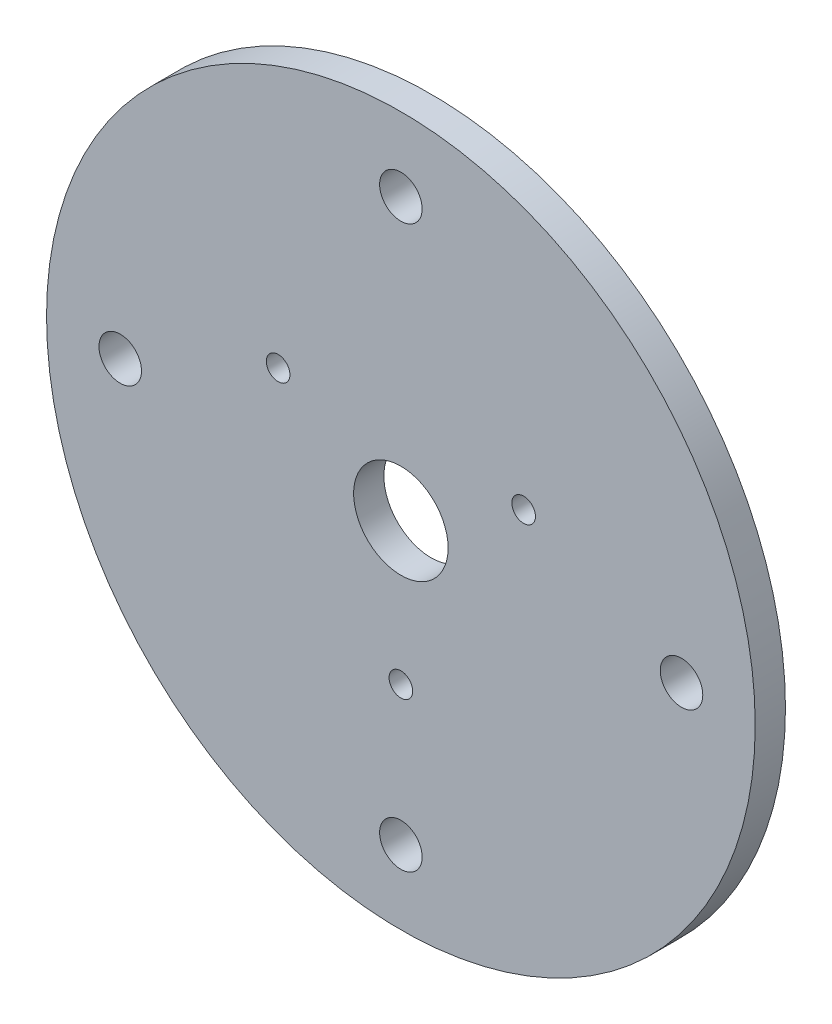
ISO-10303-21;
HEADER;
FILE_DESCRIPTION(('STEP AP214'),'2;1');
FILE_NAME('part.step','',(''),(''),'','','');
FILE_SCHEMA(('AUTOMOTIVE_DESIGN { 1 0 10303 214 1 1 1 1 }'));
ENDSEC;
DATA;
#1=APPLICATION_CONTEXT('core data for automotive mechanical design processes');
#2=APPLICATION_PROTOCOL_DEFINITION('international standard','automotive_design',2000,#1);
#3=PRODUCT_CONTEXT('',#1,'mechanical');
#4=PRODUCT('Part','Part','',(#3));
#5=PRODUCT_RELATED_PRODUCT_CATEGORY('part','',(#4));
#6=PRODUCT_DEFINITION_FORMATION('','',#4);
#7=PRODUCT_DEFINITION_CONTEXT('part definition',#1,'design');
#8=PRODUCT_DEFINITION('design','',#6,#7);
#9=PRODUCT_DEFINITION_SHAPE('','',#8);
#10=(LENGTH_UNIT() NAMED_UNIT(*) SI_UNIT(.MILLI.,.METRE.));
#11=(NAMED_UNIT(*) PLANE_ANGLE_UNIT() SI_UNIT($,.RADIAN.));
#12=(NAMED_UNIT(*) SI_UNIT($,.STERADIAN.) SOLID_ANGLE_UNIT());
#13=UNCERTAINTY_MEASURE_WITH_UNIT(LENGTH_MEASURE(1.E-05),#10,'distance_accuracy_value','');
#14=(GEOMETRIC_REPRESENTATION_CONTEXT(3) GLOBAL_UNCERTAINTY_ASSIGNED_CONTEXT((#13)) GLOBAL_UNIT_ASSIGNED_CONTEXT((#10,
#11,#12)) REPRESENTATION_CONTEXT('',''));
#15=CARTESIAN_POINT('',(0.,0.,0.));
#16=DIRECTION('',(0.,0.,1.));
#17=DIRECTION('',(1.,0.,0.));
#18=AXIS2_PLACEMENT_3D('',#15,#16,#17);
#19=CARTESIAN_POINT('',(0.,0.,3.2));
#20=DIRECTION('',(0.,0.,1.));
#21=DIRECTION('',(1.,0.,0.));
#22=AXIS2_PLACEMENT_3D('',#19,#20,#21);
#23=PLANE('',#22);
#24=CARTESIAN_POINT('',(-29.7,0.,3.2));
#25=DIRECTION('',(0.,0.,1.));
#26=DIRECTION('',(1.,0.,0.));
#27=AXIS2_PLACEMENT_3D('',#24,#25,#26);
#28=CIRCLE('',#27,2.2500000000003);
#29=CARTESIAN_POINT('',(-27.4499999999997,0.,3.2));
#30=VERTEX_POINT('',#29);
#31=EDGE_CURVE('E96',#30,#30,#28,.T.);
#32=ORIENTED_EDGE('',*,*,#31,.F.);
#33=EDGE_LOOP('',(#32));
#34=FACE_BOUND('',#33,.T.);
#35=CARTESIAN_POINT('',(29.7,0.,3.2));
#36=DIRECTION('',(0.,0.,1.));
#37=DIRECTION('',(1.,0.,0.));
#38=AXIS2_PLACEMENT_3D('',#35,#36,#37);
#39=CIRCLE('',#38,2.2500000000001);
#40=CARTESIAN_POINT('',(31.9500000000001,0.,3.2));
#41=VERTEX_POINT('',#40);
#42=EDGE_CURVE('E80',#41,#41,#39,.T.);
#43=ORIENTED_EDGE('',*,*,#42,.F.);
#44=EDGE_LOOP('',(#43));
#45=FACE_BOUND('',#44,.T.);
#46=CARTESIAN_POINT('',(-12.9903810567666,7.49999999999997,3.2));
#47=DIRECTION('',(0.,0.,1.));
#48=DIRECTION('',(1.,0.,0.));
#49=AXIS2_PLACEMENT_3D('',#46,#47,#48);
#50=CIRCLE('',#49,1.25);
#51=CARTESIAN_POINT('',(-11.7403810567666,7.49999999999997,3.2));
#52=VERTEX_POINT('',#51);
#53=EDGE_CURVE('E64',#52,#52,#50,.T.);
#54=ORIENTED_EDGE('',*,*,#53,.F.);
#55=EDGE_LOOP('',(#54));
#56=FACE_BOUND('',#55,.T.);
#57=CARTESIAN_POINT('',(0.,29.7,3.2));
#58=DIRECTION('',(0.,0.,1.));
#59=DIRECTION('',(1.,0.,0.));
#60=AXIS2_PLACEMENT_3D('',#57,#58,#59);
#61=CIRCLE('',#60,2.25);
#62=CARTESIAN_POINT('',(2.25,29.7,3.2));
#63=VERTEX_POINT('',#62);
#64=EDGE_CURVE('E50',#63,#63,#61,.T.);
#65=ORIENTED_EDGE('',*,*,#64,.F.);
#66=EDGE_LOOP('',(#65));
#67=FACE_BOUND('',#66,.T.);
#68=CARTESIAN_POINT('',(0.,0.,3.2));
#69=DIRECTION('',(0.,0.,1.));
#70=DIRECTION('',(1.,0.,0.));
#71=AXIS2_PLACEMENT_3D('',#68,#69,#70);
#72=CIRCLE('',#71,37.5);
#73=CARTESIAN_POINT('',(37.5,0.,3.2));
#74=VERTEX_POINT('',#73);
#75=EDGE_CURVE('E10',#74,#74,#72,.T.);
#76=ORIENTED_EDGE('',*,*,#75,.T.);
#77=EDGE_LOOP('',(#76));
#78=FACE_BOUND('',#77,.T.);
#79=CARTESIAN_POINT('',(0.,0.,3.2));
#80=DIRECTION('',(0.,0.,1.));
#81=DIRECTION('',(1.,0.,0.));
#82=AXIS2_PLACEMENT_3D('',#79,#80,#81);
#83=CIRCLE('',#82,5.);
#84=CARTESIAN_POINT('',(5.,0.,3.2));
#85=VERTEX_POINT('',#84);
#86=EDGE_CURVE('E56',#85,#85,#83,.T.);
#87=ORIENTED_EDGE('',*,*,#86,.F.);
#88=EDGE_LOOP('',(#87));
#89=FACE_BOUND('',#88,.T.);
#90=CARTESIAN_POINT('',(12.9903810567666,7.50000000000004,3.2));
#91=DIRECTION('',(0.,0.,1.));
#92=DIRECTION('',(1.,0.,0.));
#93=AXIS2_PLACEMENT_3D('',#90,#91,#92);
#94=CIRCLE('',#93,1.25);
#95=CARTESIAN_POINT('',(14.2403810567666,7.50000000000004,3.2));
#96=VERTEX_POINT('',#95);
#97=EDGE_CURVE('E72',#96,#96,#94,.T.);
#98=ORIENTED_EDGE('',*,*,#97,.F.);
#99=EDGE_LOOP('',(#98));
#100=FACE_BOUND('',#99,.T.);
#101=CARTESIAN_POINT('',(0.,-29.7,3.2));
#102=DIRECTION('',(0.,0.,1.));
#103=DIRECTION('',(1.,0.,0.));
#104=AXIS2_PLACEMENT_3D('',#101,#102,#103);
#105=CIRCLE('',#104,2.2500000000002);
#106=CARTESIAN_POINT('',(2.25000000000021,-29.7,3.2));
#107=VERTEX_POINT('',#106);
#108=EDGE_CURVE('E88',#107,#107,#105,.T.);
#109=ORIENTED_EDGE('',*,*,#108,.F.);
#110=EDGE_LOOP('',(#109));
#111=FACE_BOUND('',#110,.T.);
#112=CARTESIAN_POINT('',(0.,-15.,3.2));
#113=DIRECTION('',(0.,0.,1.));
#114=DIRECTION('',(1.,0.,0.));
#115=AXIS2_PLACEMENT_3D('',#112,#113,#114);
#116=CIRCLE('',#115,1.25);
#117=CARTESIAN_POINT('',(1.25000000000004,-15.,3.2));
#118=VERTEX_POINT('',#117);
#119=EDGE_CURVE('E104',#118,#118,#116,.T.);
#120=ORIENTED_EDGE('',*,*,#119,.F.);
#121=EDGE_LOOP('',(#120));
#122=FACE_BOUND('',#121,.T.);
#123=ADVANCED_FACE('F37',(#34,#45,#56,#67,#78,#89,#100,#111,#122),#23,.T.);
#124=CARTESIAN_POINT('',(0.,0.,0.));
#125=DIRECTION('',(0.,0.,1.));
#126=DIRECTION('',(1.,0.,0.));
#127=AXIS2_PLACEMENT_3D('',#124,#125,#126);
#128=PLANE('',#127);
#129=CARTESIAN_POINT('',(0.,0.,0.));
#130=DIRECTION('',(0.,0.,1.));
#131=DIRECTION('',(1.,0.,0.));
#132=AXIS2_PLACEMENT_3D('',#129,#130,#131);
#133=CIRCLE('',#132,37.5);
#134=CARTESIAN_POINT('',(37.5,0.,0.));
#135=VERTEX_POINT('',#134);
#136=EDGE_CURVE('E41',#135,#135,#133,.T.);
#137=ORIENTED_EDGE('',*,*,#136,.F.);
#138=EDGE_LOOP('',(#137));
#139=FACE_BOUND('',#138,.T.);
#140=CARTESIAN_POINT('',(0.,29.7,0.));
#141=DIRECTION('',(0.,0.,1.));
#142=DIRECTION('',(1.,0.,0.));
#143=AXIS2_PLACEMENT_3D('',#140,#141,#142);
#144=CIRCLE('',#143,2.25);
#145=CARTESIAN_POINT('',(2.25,29.7,0.));
#146=VERTEX_POINT('',#145);
#147=EDGE_CURVE('E52',#146,#146,#144,.T.);
#148=ORIENTED_EDGE('',*,*,#147,.T.);
#149=EDGE_LOOP('',(#148));
#150=FACE_BOUND('',#149,.T.);
#151=CARTESIAN_POINT('',(0.,0.,0.));
#152=DIRECTION('',(0.,0.,1.));
#153=DIRECTION('',(1.,0.,0.));
#154=AXIS2_PLACEMENT_3D('',#151,#152,#153);
#155=CIRCLE('',#154,5.);
#156=CARTESIAN_POINT('',(5.,0.,0.));
#157=VERTEX_POINT('',#156);
#158=EDGE_CURVE('E60',#157,#157,#155,.T.);
#159=ORIENTED_EDGE('',*,*,#158,.T.);
#160=EDGE_LOOP('',(#159));
#161=FACE_BOUND('',#160,.T.);
#162=CARTESIAN_POINT('',(-12.9903810567666,7.49999999999997,0.));
#163=DIRECTION('',(0.,0.,1.));
#164=DIRECTION('',(1.,0.,0.));
#165=AXIS2_PLACEMENT_3D('',#162,#163,#164);
#166=CIRCLE('',#165,1.25);
#167=CARTESIAN_POINT('',(-11.7403810567666,7.49999999999997,0.));
#168=VERTEX_POINT('',#167);
#169=EDGE_CURVE('E68',#168,#168,#166,.T.);
#170=ORIENTED_EDGE('',*,*,#169,.T.);
#171=EDGE_LOOP('',(#170));
#172=FACE_BOUND('',#171,.T.);
#173=CARTESIAN_POINT('',(12.9903810567666,7.50000000000004,0.));
#174=DIRECTION('',(0.,0.,1.));
#175=DIRECTION('',(1.,0.,0.));
#176=AXIS2_PLACEMENT_3D('',#173,#174,#175);
#177=CIRCLE('',#176,1.25);
#178=CARTESIAN_POINT('',(14.2403810567666,7.50000000000004,0.));
#179=VERTEX_POINT('',#178);
#180=EDGE_CURVE('E76',#179,#179,#177,.T.);
#181=ORIENTED_EDGE('',*,*,#180,.T.);
#182=EDGE_LOOP('',(#181));
#183=FACE_BOUND('',#182,.T.);
#184=CARTESIAN_POINT('',(29.7,0.,0.));
#185=DIRECTION('',(0.,0.,1.));
#186=DIRECTION('',(1.,0.,0.));
#187=AXIS2_PLACEMENT_3D('',#184,#185,#186);
#188=CIRCLE('',#187,2.2500000000001);
#189=CARTESIAN_POINT('',(31.9500000000001,0.,0.));
#190=VERTEX_POINT('',#189);
#191=EDGE_CURVE('E84',#190,#190,#188,.T.);
#192=ORIENTED_EDGE('',*,*,#191,.T.);
#193=EDGE_LOOP('',(#192));
#194=FACE_BOUND('',#193,.T.);
#195=CARTESIAN_POINT('',(0.,-29.7,0.));
#196=DIRECTION('',(0.,0.,1.));
#197=DIRECTION('',(1.,0.,0.));
#198=AXIS2_PLACEMENT_3D('',#195,#196,#197);
#199=CIRCLE('',#198,2.2500000000002);
#200=CARTESIAN_POINT('',(2.25000000000021,-29.7,0.));
#201=VERTEX_POINT('',#200);
#202=EDGE_CURVE('E92',#201,#201,#199,.T.);
#203=ORIENTED_EDGE('',*,*,#202,.T.);
#204=EDGE_LOOP('',(#203));
#205=FACE_BOUND('',#204,.T.);
#206=CARTESIAN_POINT('',(-29.7,0.,0.));
#207=DIRECTION('',(0.,0.,1.));
#208=DIRECTION('',(1.,0.,0.));
#209=AXIS2_PLACEMENT_3D('',#206,#207,#208);
#210=CIRCLE('',#209,2.2500000000003);
#211=CARTESIAN_POINT('',(-27.4499999999997,0.,0.));
#212=VERTEX_POINT('',#211);
#213=EDGE_CURVE('E100',#212,#212,#210,.T.);
#214=ORIENTED_EDGE('',*,*,#213,.T.);
#215=EDGE_LOOP('',(#214));
#216=FACE_BOUND('',#215,.T.);
#217=CARTESIAN_POINT('',(0.,-15.,0.));
#218=DIRECTION('',(0.,0.,1.));
#219=DIRECTION('',(1.,0.,0.));
#220=AXIS2_PLACEMENT_3D('',#217,#218,#219);
#221=CIRCLE('',#220,1.25);
#222=CARTESIAN_POINT('',(1.25000000000004,-15.,0.));
#223=VERTEX_POINT('',#222);
#224=EDGE_CURVE('E108',#223,#223,#221,.T.);
#225=ORIENTED_EDGE('',*,*,#224,.T.);
#226=EDGE_LOOP('',(#225));
#227=FACE_BOUND('',#226,.T.);
#228=ADVANCED_FACE('F120',(#139,#150,#161,#172,#183,#194,#205,#216,#227),#128,.F.);
#229=CARTESIAN_POINT('',(0.,0.,3.2));
#230=DIRECTION('',(0.,0.,-1.));
#231=DIRECTION('',(-1.,0.,0.));
#232=AXIS2_PLACEMENT_3D('',#229,#230,#231);
#233=CYLINDRICAL_SURFACE('',#232,37.5);
#234=ORIENTED_EDGE('',*,*,#75,.F.);
#235=EDGE_LOOP('',(#234));
#236=FACE_BOUND('',#235,.T.);
#237=ORIENTED_EDGE('',*,*,#136,.T.);
#238=EDGE_LOOP('',(#237));
#239=FACE_BOUND('',#238,.T.);
#240=ADVANCED_FACE('F39',(#236,#239),#233,.T.);
#241=CARTESIAN_POINT('',(0.,29.7,3.2));
#242=DIRECTION('',(0.,0.,-1.));
#243=DIRECTION('',(-1.,0.,0.));
#244=AXIS2_PLACEMENT_3D('',#241,#242,#243);
#245=CYLINDRICAL_SURFACE('',#244,2.25);
#246=ORIENTED_EDGE('',*,*,#64,.T.);
#247=EDGE_LOOP('',(#246));
#248=FACE_BOUND('',#247,.T.);
#249=ORIENTED_EDGE('',*,*,#147,.F.);
#250=EDGE_LOOP('',(#249));
#251=FACE_BOUND('',#250,.T.);
#252=ADVANCED_FACE('F130',(#248,#251),#245,.F.);
#253=CARTESIAN_POINT('',(0.,0.,3.2));
#254=DIRECTION('',(0.,0.,-1.));
#255=DIRECTION('',(-1.,0.,0.));
#256=AXIS2_PLACEMENT_3D('',#253,#254,#255);
#257=CYLINDRICAL_SURFACE('',#256,5.);
#258=ORIENTED_EDGE('',*,*,#86,.T.);
#259=EDGE_LOOP('',(#258));
#260=FACE_BOUND('',#259,.T.);
#261=ORIENTED_EDGE('',*,*,#158,.F.);
#262=EDGE_LOOP('',(#261));
#263=FACE_BOUND('',#262,.T.);
#264=ADVANCED_FACE('F133',(#260,#263),#257,.F.);
#265=CARTESIAN_POINT('',(-12.9903810567666,7.49999999999997,3.2));
#266=DIRECTION('',(0.,0.,-1.));
#267=DIRECTION('',(-1.,0.,0.));
#268=AXIS2_PLACEMENT_3D('',#265,#266,#267);
#269=CYLINDRICAL_SURFACE('',#268,1.25);
#270=ORIENTED_EDGE('',*,*,#53,.T.);
#271=EDGE_LOOP('',(#270));
#272=FACE_BOUND('',#271,.T.);
#273=ORIENTED_EDGE('',*,*,#169,.F.);
#274=EDGE_LOOP('',(#273));
#275=FACE_BOUND('',#274,.T.);
#276=ADVANCED_FACE('F137',(#272,#275),#269,.F.);
#277=CARTESIAN_POINT('',(12.9903810567666,7.50000000000004,3.2));
#278=DIRECTION('',(0.,0.,-1.));
#279=DIRECTION('',(-1.,0.,0.));
#280=AXIS2_PLACEMENT_3D('',#277,#278,#279);
#281=CYLINDRICAL_SURFACE('',#280,1.25);
#282=ORIENTED_EDGE('',*,*,#97,.T.);
#283=EDGE_LOOP('',(#282));
#284=FACE_BOUND('',#283,.T.);
#285=ORIENTED_EDGE('',*,*,#180,.F.);
#286=EDGE_LOOP('',(#285));
#287=FACE_BOUND('',#286,.T.);
#288=ADVANCED_FACE('F141',(#284,#287),#281,.F.);
#289=CARTESIAN_POINT('',(29.7,0.,3.2));
#290=DIRECTION('',(0.,0.,-1.));
#291=DIRECTION('',(-1.,0.,0.));
#292=AXIS2_PLACEMENT_3D('',#289,#290,#291);
#293=CYLINDRICAL_SURFACE('',#292,2.2500000000001);
#294=ORIENTED_EDGE('',*,*,#42,.T.);
#295=EDGE_LOOP('',(#294));
#296=FACE_BOUND('',#295,.T.);
#297=ORIENTED_EDGE('',*,*,#191,.F.);
#298=EDGE_LOOP('',(#297));
#299=FACE_BOUND('',#298,.T.);
#300=ADVANCED_FACE('F145',(#296,#299),#293,.F.);
#301=CARTESIAN_POINT('',(0.,-29.7,3.2));
#302=DIRECTION('',(0.,0.,-1.));
#303=DIRECTION('',(-1.,0.,0.));
#304=AXIS2_PLACEMENT_3D('',#301,#302,#303);
#305=CYLINDRICAL_SURFACE('',#304,2.2500000000002);
#306=ORIENTED_EDGE('',*,*,#108,.T.);
#307=EDGE_LOOP('',(#306));
#308=FACE_BOUND('',#307,.T.);
#309=ORIENTED_EDGE('',*,*,#202,.F.);
#310=EDGE_LOOP('',(#309));
#311=FACE_BOUND('',#310,.T.);
#312=ADVANCED_FACE('F149',(#308,#311),#305,.F.);
#313=CARTESIAN_POINT('',(-29.7,0.,3.2));
#314=DIRECTION('',(0.,0.,-1.));
#315=DIRECTION('',(-1.,0.,0.));
#316=AXIS2_PLACEMENT_3D('',#313,#314,#315);
#317=CYLINDRICAL_SURFACE('',#316,2.2500000000003);
#318=ORIENTED_EDGE('',*,*,#31,.T.);
#319=EDGE_LOOP('',(#318));
#320=FACE_BOUND('',#319,.T.);
#321=ORIENTED_EDGE('',*,*,#213,.F.);
#322=EDGE_LOOP('',(#321));
#323=FACE_BOUND('',#322,.T.);
#324=ADVANCED_FACE('F153',(#320,#323),#317,.F.);
#325=CARTESIAN_POINT('',(0.,-15.,3.2));
#326=DIRECTION('',(0.,0.,-1.));
#327=DIRECTION('',(-1.,0.,0.));
#328=AXIS2_PLACEMENT_3D('',#325,#326,#327);
#329=CYLINDRICAL_SURFACE('',#328,1.25);
#330=ORIENTED_EDGE('',*,*,#119,.T.);
#331=EDGE_LOOP('',(#330));
#332=FACE_BOUND('',#331,.T.);
#333=ORIENTED_EDGE('',*,*,#224,.F.);
#334=EDGE_LOOP('',(#333));
#335=FACE_BOUND('',#334,.T.);
#336=ADVANCED_FACE('F116',(#332,#335),#329,.F.);
#337=CLOSED_SHELL('',(#123,#228,#240,#252,#264,#276,#288,#300,#312,#324,#336));
#338=MANIFOLD_SOLID_BREP('B2',#337);
#339=ADVANCED_BREP_SHAPE_REPRESENTATION('',(#18,#338),#14);
#340=SHAPE_DEFINITION_REPRESENTATION(#9,#339);
ENDSEC;
END-ISO-10303-21;
